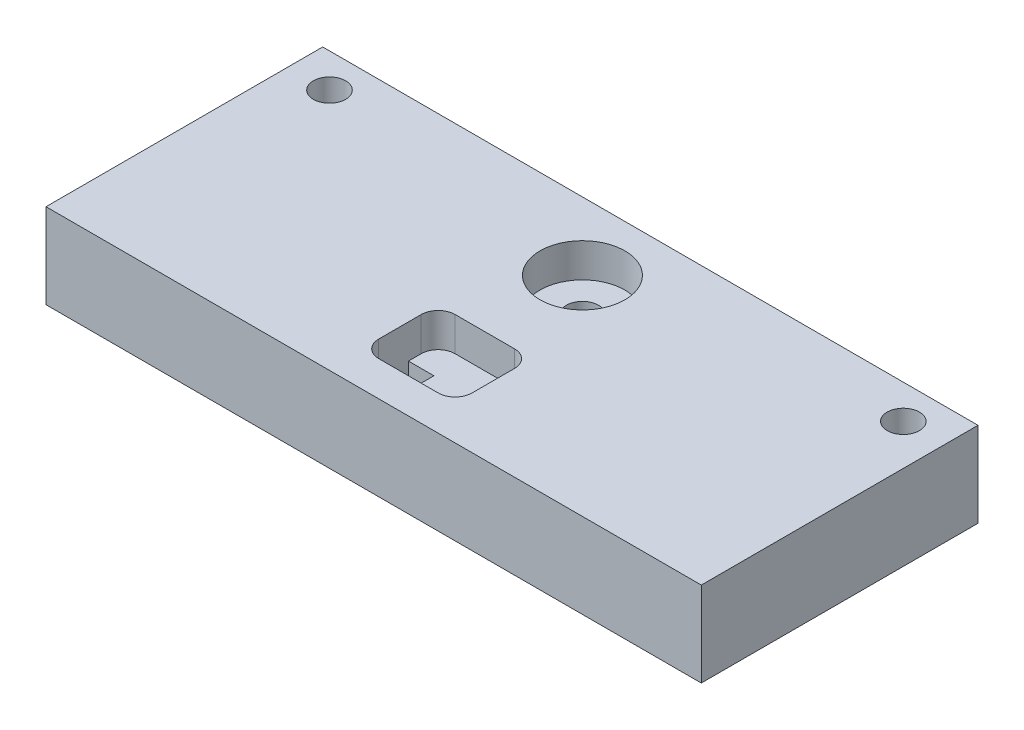
ISO-10303-21;
HEADER;
FILE_DESCRIPTION(('STEP AP214'),'2;1');
FILE_NAME('part.step','',(''),(''),'','','');
FILE_SCHEMA(('AUTOMOTIVE_DESIGN { 1 0 10303 214 1 1 1 1 }'));
ENDSEC;
DATA;
#1=APPLICATION_CONTEXT('core data for automotive mechanical design processes');
#2=APPLICATION_PROTOCOL_DEFINITION('international standard','automotive_design',2000,#1);
#3=PRODUCT_CONTEXT('',#1,'mechanical');
#4=PRODUCT('Part','Part','',(#3));
#5=PRODUCT_RELATED_PRODUCT_CATEGORY('part','',(#4));
#6=PRODUCT_DEFINITION_FORMATION('','',#4);
#7=PRODUCT_DEFINITION_CONTEXT('part definition',#1,'design');
#8=PRODUCT_DEFINITION('design','',#6,#7);
#9=PRODUCT_DEFINITION_SHAPE('','',#8);
#10=(LENGTH_UNIT() NAMED_UNIT(*) SI_UNIT(.MILLI.,.METRE.));
#11=(NAMED_UNIT(*) PLANE_ANGLE_UNIT() SI_UNIT($,.RADIAN.));
#12=(NAMED_UNIT(*) SI_UNIT($,.STERADIAN.) SOLID_ANGLE_UNIT());
#13=UNCERTAINTY_MEASURE_WITH_UNIT(LENGTH_MEASURE(1.E-05),#10,'distance_accuracy_value','');
#14=(GEOMETRIC_REPRESENTATION_CONTEXT(3) GLOBAL_UNCERTAINTY_ASSIGNED_CONTEXT((#13)) GLOBAL_UNIT_ASSIGNED_CONTEXT((#10,
#11,#12)) REPRESENTATION_CONTEXT('',''));
#15=CARTESIAN_POINT('',(0.,0.,0.));
#16=DIRECTION('',(0.,0.,1.));
#17=DIRECTION('',(1.,0.,0.));
#18=AXIS2_PLACEMENT_3D('',#15,#16,#17);
#19=CARTESIAN_POINT('',(0.,2.,0.));
#20=DIRECTION('',(0.,1.,0.));
#21=DIRECTION('',(0.,0.,1.));
#22=AXIS2_PLACEMENT_3D('',#19,#20,#21);
#23=PLANE('',#22);
#24=CARTESIAN_POINT('',(-16.8999999999963,2.,-9.99999999999545));
#25=DIRECTION('',(0.,1.,0.));
#26=DIRECTION('',(0.,0.,1.));
#27=AXIS2_PLACEMENT_3D('',#24,#25,#26);
#28=CIRCLE('',#27,0.950000000000001);
#29=CARTESIAN_POINT('',(-16.8999999999963,2.,-9.04999999999545));
#30=VERTEX_POINT('',#29);
#31=EDGE_CURVE('E298',#30,#30,#28,.T.);
#32=ORIENTED_EDGE('',*,*,#31,.F.);
#33=EDGE_LOOP('',(#32));
#34=FACE_BOUND('',#33,.T.);
#35=CARTESIAN_POINT('',(16.8999999999963,2.,-9.99999999999545));
#36=DIRECTION('',(0.,1.,0.));
#37=DIRECTION('',(0.,0.,1.));
#38=AXIS2_PLACEMENT_3D('',#35,#36,#37);
#39=CIRCLE('',#38,0.950000000000001);
#40=CARTESIAN_POINT('',(16.8999999999963,2.,-9.04999999999545));
#41=VERTEX_POINT('',#40);
#42=EDGE_CURVE('E301',#41,#41,#39,.T.);
#43=ORIENTED_EDGE('',*,*,#42,.F.);
#44=EDGE_LOOP('',(#43));
#45=FACE_BOUND('',#44,.T.);
#46=DIRECTION('',(0.,0.,1.));
#47=VECTOR('',#46,1.);
#48=CARTESIAN_POINT('',(-2.75,2.,-1.25));
#49=LINE('',#48,#47);
#50=CARTESIAN_POINT('',(-2.75,2.,-1.25));
#51=VERTEX_POINT('',#50);
#52=CARTESIAN_POINT('',(-2.75,2.,1.25));
#53=VERTEX_POINT('',#52);
#54=EDGE_CURVE('E404',#51,#53,#49,.T.);
#55=ORIENTED_EDGE('',*,*,#54,.F.);
#56=CARTESIAN_POINT('',(-1.75,2.,-1.25));
#57=DIRECTION('',(0.,1.,0.));
#58=DIRECTION('',(0.,0.,1.));
#59=AXIS2_PLACEMENT_3D('',#56,#57,#58);
#60=CIRCLE('',#59,1.);
#61=CARTESIAN_POINT('',(-1.75,2.,-2.25));
#62=VERTEX_POINT('',#61);
#63=EDGE_CURVE('E402',#62,#51,#60,.T.);
#64=ORIENTED_EDGE('',*,*,#63,.F.);
#65=DIRECTION('',(-1.,0.,0.));
#66=VECTOR('',#65,1.);
#67=CARTESIAN_POINT('',(-1.75,2.,-2.25));
#68=LINE('',#67,#66);
#69=CARTESIAN_POINT('',(1.75,2.,-2.25));
#70=VERTEX_POINT('',#69);
#71=EDGE_CURVE('E418',#70,#62,#68,.T.);
#72=ORIENTED_EDGE('',*,*,#71,.F.);
#73=CARTESIAN_POINT('',(1.75,2.,-1.25));
#74=DIRECTION('',(0.,1.,0.));
#75=DIRECTION('',(0.,0.,-1.));
#76=AXIS2_PLACEMENT_3D('',#73,#74,#75);
#77=CIRCLE('',#76,1.);
#78=CARTESIAN_POINT('',(2.75,2.,-1.25));
#79=VERTEX_POINT('',#78);
#80=EDGE_CURVE('E415',#79,#70,#77,.T.);
#81=ORIENTED_EDGE('',*,*,#80,.F.);
#82=DIRECTION('',(0.,0.,-1.));
#83=VECTOR('',#82,1.);
#84=CARTESIAN_POINT('',(2.75,2.,-1.25));
#85=LINE('',#84,#83);
#86=CARTESIAN_POINT('',(2.75,2.,1.25));
#87=VERTEX_POINT('',#86);
#88=EDGE_CURVE('E413',#87,#79,#85,.T.);
#89=ORIENTED_EDGE('',*,*,#88,.F.);
#90=CARTESIAN_POINT('',(1.75,2.,1.25));
#91=DIRECTION('',(0.,1.,0.));
#92=DIRECTION('',(0.,0.,-1.));
#93=AXIS2_PLACEMENT_3D('',#90,#91,#92);
#94=CIRCLE('',#93,1.);
#95=CARTESIAN_POINT('',(1.75,2.,2.25));
#96=VERTEX_POINT('',#95);
#97=EDGE_CURVE('E411',#96,#87,#94,.T.);
#98=ORIENTED_EDGE('',*,*,#97,.F.);
#99=DIRECTION('',(1.,0.,0.));
#100=VECTOR('',#99,1.);
#101=CARTESIAN_POINT('',(-1.75,2.,2.25));
#102=LINE('',#101,#100);
#103=CARTESIAN_POINT('',(-1.75,2.,2.25));
#104=VERTEX_POINT('',#103);
#105=EDGE_CURVE('E409',#104,#96,#102,.T.);
#106=ORIENTED_EDGE('',*,*,#105,.F.);
#107=CARTESIAN_POINT('',(-1.75,2.,1.25));
#108=DIRECTION('',(0.,1.,0.));
#109=DIRECTION('',(0.,0.,1.));
#110=AXIS2_PLACEMENT_3D('',#107,#108,#109);
#111=CIRCLE('',#110,1.);
#112=EDGE_CURVE('E407',#53,#104,#111,.T.);
#113=ORIENTED_EDGE('',*,*,#112,.F.);
#114=EDGE_LOOP('',(#55,#64,#72,#81,#89,#98,#106,#113));
#115=FACE_BOUND('',#114,.T.);
#116=DIRECTION('',(-1.,0.,0.));
#117=VECTOR('',#116,1.);
#118=CARTESIAN_POINT('',(-5.00000000000001,2.,-12.));
#119=LINE('',#118,#117);
#120=CARTESIAN_POINT('',(19.3,2.,-12.));
#121=VERTEX_POINT('',#120);
#122=CARTESIAN_POINT('',(-19.3,2.,-12.));
#123=VERTEX_POINT('',#122);
#124=EDGE_CURVE('E11',#121,#123,#119,.T.);
#125=ORIENTED_EDGE('',*,*,#124,.T.);
#126=DIRECTION('',(0.,0.,-1.));
#127=VECTOR('',#126,1.);
#128=CARTESIAN_POINT('',(-19.3,2.,-12.));
#129=LINE('',#128,#127);
#130=CARTESIAN_POINT('',(-19.3,2.,4.29999999999999));
#131=VERTEX_POINT('',#130);
#132=EDGE_CURVE('E309',#131,#123,#129,.T.);
#133=ORIENTED_EDGE('',*,*,#132,.F.);
#134=DIRECTION('',(1.,0.,0.));
#135=VECTOR('',#134,1.);
#136=CARTESIAN_POINT('',(-5.,2.,4.3));
#137=LINE('',#136,#135);
#138=CARTESIAN_POINT('',(19.3,2.,4.3));
#139=VERTEX_POINT('',#138);
#140=EDGE_CURVE('E49',#131,#139,#137,.T.);
#141=ORIENTED_EDGE('',*,*,#140,.T.);
#142=DIRECTION('',(0.,0.,1.));
#143=VECTOR('',#142,1.);
#144=CARTESIAN_POINT('',(19.3,2.,-12.));
#145=LINE('',#144,#143);
#146=EDGE_CURVE('E318',#121,#139,#145,.T.);
#147=ORIENTED_EDGE('',*,*,#146,.F.);
#148=EDGE_LOOP('',(#125,#133,#141,#147));
#149=FACE_BOUND('',#148,.T.);
#150=CARTESIAN_POINT('',(0.,2.,-8.));
#151=DIRECTION('',(0.,1.,0.));
#152=DIRECTION('',(0.,0.,1.));
#153=AXIS2_PLACEMENT_3D('',#150,#151,#152);
#154=CIRCLE('',#153,2.5);
#155=CARTESIAN_POINT('',(0.,2.,-5.5));
#156=VERTEX_POINT('',#155);
#157=EDGE_CURVE('E396',#156,#156,#154,.T.);
#158=ORIENTED_EDGE('',*,*,#157,.F.);
#159=EDGE_LOOP('',(#158));
#160=FACE_BOUND('',#159,.T.);
#161=ADVANCED_FACE('F41',(#34,#45,#115,#149,#160),#23,.T.);
#162=CARTESIAN_POINT('',(-5.,2.,4.3));
#163=DIRECTION('',(0.,0.,-1.));
#164=DIRECTION('',(-1.,0.,0.));
#165=AXIS2_PLACEMENT_3D('',#162,#163,#164);
#166=PLANE('',#165);
#167=ORIENTED_EDGE('',*,*,#140,.F.);
#168=DIRECTION('',(0.,-1.,0.));
#169=VECTOR('',#168,1.);
#170=CARTESIAN_POINT('',(-19.3,2.,4.29999999999999));
#171=LINE('',#170,#169);
#172=CARTESIAN_POINT('',(-19.3,-3.,4.29999999999999));
#173=VERTEX_POINT('',#172);
#174=EDGE_CURVE('E306',#131,#173,#171,.T.);
#175=ORIENTED_EDGE('',*,*,#174,.T.);
#176=DIRECTION('',(-1.,0.,0.));
#177=VECTOR('',#176,1.);
#178=CARTESIAN_POINT('',(-5.,-3.,4.3));
#179=LINE('',#178,#177);
#180=CARTESIAN_POINT('',(19.3,-3.,4.3));
#181=VERTEX_POINT('',#180);
#182=EDGE_CURVE('E393',#181,#173,#179,.T.);
#183=ORIENTED_EDGE('',*,*,#182,.F.);
#184=DIRECTION('',(0.,-1.,0.));
#185=VECTOR('',#184,1.);
#186=CARTESIAN_POINT('',(19.3,2.,4.3));
#187=LINE('',#186,#185);
#188=EDGE_CURVE('E324',#139,#181,#187,.T.);
#189=ORIENTED_EDGE('',*,*,#188,.F.);
#190=EDGE_LOOP('',(#167,#175,#183,#189));
#191=FACE_BOUND('',#190,.T.);
#192=ADVANCED_FACE('F43',(#191),#166,.F.);
#193=CARTESIAN_POINT('',(-5.00000000000001,2.,-12.));
#194=DIRECTION('',(0.,0.,1.));
#195=DIRECTION('',(1.,0.,0.));
#196=AXIS2_PLACEMENT_3D('',#193,#194,#195);
#197=PLANE('',#196);
#198=ORIENTED_EDGE('',*,*,#124,.F.);
#199=DIRECTION('',(0.,-1.,0.));
#200=VECTOR('',#199,1.);
#201=CARTESIAN_POINT('',(19.3,2.,-12.));
#202=LINE('',#201,#200);
#203=CARTESIAN_POINT('',(19.3,-3.,-12.));
#204=VERTEX_POINT('',#203);
#205=EDGE_CURVE('E321',#121,#204,#202,.T.);
#206=ORIENTED_EDGE('',*,*,#205,.T.);
#207=DIRECTION('',(1.,0.,0.));
#208=VECTOR('',#207,1.);
#209=CARTESIAN_POINT('',(-5.,-3.,-12.));
#210=LINE('',#209,#208);
#211=CARTESIAN_POINT('',(-19.3,-3.,-12.));
#212=VERTEX_POINT('',#211);
#213=EDGE_CURVE('E389',#212,#204,#210,.T.);
#214=ORIENTED_EDGE('',*,*,#213,.F.);
#215=DIRECTION('',(0.,-1.,0.));
#216=VECTOR('',#215,1.);
#217=CARTESIAN_POINT('',(-19.3,2.,-12.));
#218=LINE('',#217,#216);
#219=EDGE_CURVE('E297',#123,#212,#218,.T.);
#220=ORIENTED_EDGE('',*,*,#219,.F.);
#221=EDGE_LOOP('',(#198,#206,#214,#220));
#222=FACE_BOUND('',#221,.T.);
#223=ADVANCED_FACE('F470',(#222),#197,.F.);
#224=CARTESIAN_POINT('',(-1.75,2.,-1.25));
#225=DIRECTION('',(0.,-1.,0.));
#226=DIRECTION('',(0.,0.,-1.));
#227=AXIS2_PLACEMENT_3D('',#224,#225,#226);
#228=CYLINDRICAL_SURFACE('',#227,1.);
#229=CARTESIAN_POINT('',(-1.75,0.,-1.25));
#230=DIRECTION('',(0.,1.,0.));
#231=DIRECTION('',(0.,0.,1.));
#232=AXIS2_PLACEMENT_3D('',#229,#230,#231);
#233=CIRCLE('',#232,1.);
#234=CARTESIAN_POINT('',(-1.75,0.,-2.25));
#235=VERTEX_POINT('',#234);
#236=CARTESIAN_POINT('',(-2.75,0.,-1.25));
#237=VERTEX_POINT('',#236);
#238=EDGE_CURVE('E399',#235,#237,#233,.T.);
#239=ORIENTED_EDGE('',*,*,#238,.F.);
#240=DIRECTION('',(0.,-1.,0.));
#241=VECTOR('',#240,1.);
#242=CARTESIAN_POINT('',(-1.75,2.,-2.25));
#243=LINE('',#242,#241);
#244=EDGE_CURVE('E420',#62,#235,#243,.T.);
#245=ORIENTED_EDGE('',*,*,#244,.F.);
#246=ORIENTED_EDGE('',*,*,#63,.T.);
#247=DIRECTION('',(0.,-1.,0.));
#248=VECTOR('',#247,1.);
#249=CARTESIAN_POINT('',(-2.75,2.,-1.25));
#250=LINE('',#249,#248);
#251=EDGE_CURVE('E456',#51,#237,#250,.T.);
#252=ORIENTED_EDGE('',*,*,#251,.T.);
#253=EDGE_LOOP('',(#239,#245,#246,#252));
#254=FACE_BOUND('',#253,.T.);
#255=ADVANCED_FACE('F525',(#254),#228,.F.);
#256=CARTESIAN_POINT('',(-2.75,2.,-1.25));
#257=DIRECTION('',(1.,0.,0.));
#258=DIRECTION('',(0.,0.,-1.));
#259=AXIS2_PLACEMENT_3D('',#256,#257,#258);
#260=PLANE('',#259);
#261=DIRECTION('',(0.,0.,1.));
#262=VECTOR('',#261,1.);
#263=CARTESIAN_POINT('',(-2.75,0.,-1.25));
#264=LINE('',#263,#262);
#265=CARTESIAN_POINT('',(-2.75,0.,-0.5));
#266=VERTEX_POINT('',#265);
#267=EDGE_CURVE('E424',#237,#266,#264,.T.);
#268=ORIENTED_EDGE('',*,*,#267,.F.);
#269=ORIENTED_EDGE('',*,*,#251,.F.);
#270=ORIENTED_EDGE('',*,*,#54,.T.);
#271=DIRECTION('',(0.,-1.,0.));
#272=VECTOR('',#271,1.);
#273=CARTESIAN_POINT('',(-2.75,2.,1.25));
#274=LINE('',#273,#272);
#275=CARTESIAN_POINT('',(-2.75,0.,1.25));
#276=VERTEX_POINT('',#275);
#277=EDGE_CURVE('E454',#53,#276,#274,.T.);
#278=ORIENTED_EDGE('',*,*,#277,.T.);
#279=CARTESIAN_POINT('',(-2.75,0.,0.5));
#280=VERTEX_POINT('',#279);
#281=EDGE_CURVE('E423',#280,#276,#264,.T.);
#282=ORIENTED_EDGE('',*,*,#281,.F.);
#283=DIRECTION('',(0.,1.,0.));
#284=VECTOR('',#283,1.);
#285=CARTESIAN_POINT('',(-2.75,-3.,0.499999999999999));
#286=LINE('',#285,#284);
#287=CARTESIAN_POINT('',(-2.75,-3.,0.499999999999999));
#288=VERTEX_POINT('',#287);
#289=EDGE_CURVE('E368',#288,#280,#286,.T.);
#290=ORIENTED_EDGE('',*,*,#289,.F.);
#291=DIRECTION('',(0.,0.,-1.));
#292=VECTOR('',#291,1.);
#293=CARTESIAN_POINT('',(-2.75,-3.,-0.500000000000001));
#294=LINE('',#293,#292);
#295=CARTESIAN_POINT('',(-2.75,-3.,-0.500000000000001));
#296=VERTEX_POINT('',#295);
#297=EDGE_CURVE('E358',#288,#296,#294,.T.);
#298=ORIENTED_EDGE('',*,*,#297,.T.);
#299=DIRECTION('',(0.,1.,0.));
#300=VECTOR('',#299,1.);
#301=CARTESIAN_POINT('',(-2.75,-3.,-0.500000000000001));
#302=LINE('',#301,#300);
#303=EDGE_CURVE('E382',#296,#266,#302,.T.);
#304=ORIENTED_EDGE('',*,*,#303,.T.);
#305=EDGE_LOOP('',(#268,#269,#270,#278,#282,#290,#298,#304));
#306=FACE_BOUND('',#305,.T.);
#307=ADVANCED_FACE('F534',(#306),#260,.T.);
#308=CARTESIAN_POINT('',(-1.75,2.,1.25));
#309=DIRECTION('',(0.,-1.,0.));
#310=DIRECTION('',(0.,0.,-1.));
#311=AXIS2_PLACEMENT_3D('',#308,#309,#310);
#312=CYLINDRICAL_SURFACE('',#311,1.);
#313=CARTESIAN_POINT('',(-1.75,0.,1.25));
#314=DIRECTION('',(0.,1.,0.));
#315=DIRECTION('',(0.,0.,1.));
#316=AXIS2_PLACEMENT_3D('',#313,#314,#315);
#317=CIRCLE('',#316,1.);
#318=CARTESIAN_POINT('',(-1.75,0.,2.25));
#319=VERTEX_POINT('',#318);
#320=EDGE_CURVE('E426',#276,#319,#317,.T.);
#321=ORIENTED_EDGE('',*,*,#320,.F.);
#322=ORIENTED_EDGE('',*,*,#277,.F.);
#323=ORIENTED_EDGE('',*,*,#112,.T.);
#324=DIRECTION('',(0.,-1.,0.));
#325=VECTOR('',#324,1.);
#326=CARTESIAN_POINT('',(-1.75,2.,2.25));
#327=LINE('',#326,#325);
#328=EDGE_CURVE('E452',#104,#319,#327,.T.);
#329=ORIENTED_EDGE('',*,*,#328,.T.);
#330=EDGE_LOOP('',(#321,#322,#323,#329));
#331=FACE_BOUND('',#330,.T.);
#332=ADVANCED_FACE('F548',(#331),#312,.F.);
#333=CARTESIAN_POINT('',(-1.75,2.,2.25));
#334=DIRECTION('',(0.,0.,-1.));
#335=DIRECTION('',(-1.,0.,0.));
#336=AXIS2_PLACEMENT_3D('',#333,#334,#335);
#337=PLANE('',#336);
#338=DIRECTION('',(1.,0.,0.));
#339=VECTOR('',#338,1.);
#340=CARTESIAN_POINT('',(-1.75,0.,2.25));
#341=LINE('',#340,#339);
#342=CARTESIAN_POINT('',(1.75,0.,2.25));
#343=VERTEX_POINT('',#342);
#344=EDGE_CURVE('E429',#319,#343,#341,.T.);
#345=ORIENTED_EDGE('',*,*,#344,.F.);
#346=ORIENTED_EDGE('',*,*,#328,.F.);
#347=ORIENTED_EDGE('',*,*,#105,.T.);
#348=DIRECTION('',(0.,-1.,0.));
#349=VECTOR('',#348,1.);
#350=CARTESIAN_POINT('',(1.75,2.,2.25));
#351=LINE('',#350,#349);
#352=EDGE_CURVE('E450',#96,#343,#351,.T.);
#353=ORIENTED_EDGE('',*,*,#352,.T.);
#354=EDGE_LOOP('',(#345,#346,#347,#353));
#355=FACE_BOUND('',#354,.T.);
#356=ADVANCED_FACE('F553',(#355),#337,.T.);
#357=CARTESIAN_POINT('',(1.75,2.,1.25));
#358=DIRECTION('',(0.,-1.,0.));
#359=DIRECTION('',(0.,0.,-1.));
#360=AXIS2_PLACEMENT_3D('',#357,#358,#359);
#361=CYLINDRICAL_SURFACE('',#360,1.);
#362=CARTESIAN_POINT('',(1.75,0.,1.25));
#363=DIRECTION('',(0.,1.,0.));
#364=DIRECTION('',(0.,0.,-1.));
#365=AXIS2_PLACEMENT_3D('',#362,#363,#364);
#366=CIRCLE('',#365,1.);
#367=CARTESIAN_POINT('',(2.75,0.,1.25));
#368=VERTEX_POINT('',#367);
#369=EDGE_CURVE('E432',#343,#368,#366,.T.);
#370=ORIENTED_EDGE('',*,*,#369,.F.);
#371=ORIENTED_EDGE('',*,*,#352,.F.);
#372=ORIENTED_EDGE('',*,*,#97,.T.);
#373=DIRECTION('',(0.,-1.,0.));
#374=VECTOR('',#373,1.);
#375=CARTESIAN_POINT('',(2.75,2.,1.25));
#376=LINE('',#375,#374);
#377=EDGE_CURVE('E448',#87,#368,#376,.T.);
#378=ORIENTED_EDGE('',*,*,#377,.T.);
#379=EDGE_LOOP('',(#370,#371,#372,#378));
#380=FACE_BOUND('',#379,.T.);
#381=ADVANCED_FACE('F557',(#380),#361,.F.);
#382=CARTESIAN_POINT('',(2.75,2.,-1.25));
#383=DIRECTION('',(-1.,0.,0.));
#384=DIRECTION('',(0.,0.,1.));
#385=AXIS2_PLACEMENT_3D('',#382,#383,#384);
#386=PLANE('',#385);
#387=DIRECTION('',(0.,0.,-1.));
#388=VECTOR('',#387,1.);
#389=CARTESIAN_POINT('',(2.75,0.,-1.25));
#390=LINE('',#389,#388);
#391=CARTESIAN_POINT('',(2.75,0.,0.5));
#392=VERTEX_POINT('',#391);
#393=EDGE_CURVE('E436',#368,#392,#390,.T.);
#394=ORIENTED_EDGE('',*,*,#393,.F.);
#395=ORIENTED_EDGE('',*,*,#377,.F.);
#396=ORIENTED_EDGE('',*,*,#88,.T.);
#397=DIRECTION('',(0.,-1.,0.));
#398=VECTOR('',#397,1.);
#399=CARTESIAN_POINT('',(2.75,2.,-1.25));
#400=LINE('',#399,#398);
#401=CARTESIAN_POINT('',(2.75,0.,-1.25));
#402=VERTEX_POINT('',#401);
#403=EDGE_CURVE('E446',#79,#402,#400,.T.);
#404=ORIENTED_EDGE('',*,*,#403,.T.);
#405=CARTESIAN_POINT('',(2.75,0.,-0.5));
#406=VERTEX_POINT('',#405);
#407=EDGE_CURVE('E435',#406,#402,#390,.T.);
#408=ORIENTED_EDGE('',*,*,#407,.F.);
#409=DIRECTION('',(0.,1.,0.));
#410=VECTOR('',#409,1.);
#411=CARTESIAN_POINT('',(2.75,-3.,-0.5));
#412=LINE('',#411,#410);
#413=CARTESIAN_POINT('',(2.75,-3.,-0.5));
#414=VERTEX_POINT('',#413);
#415=EDGE_CURVE('E340',#414,#406,#412,.T.);
#416=ORIENTED_EDGE('',*,*,#415,.F.);
#417=DIRECTION('',(0.,0.,1.));
#418=VECTOR('',#417,1.);
#419=CARTESIAN_POINT('',(2.75,-3.,-0.5));
#420=LINE('',#419,#418);
#421=CARTESIAN_POINT('',(2.75,-3.,0.5));
#422=VERTEX_POINT('',#421);
#423=EDGE_CURVE('E330',#414,#422,#420,.T.);
#424=ORIENTED_EDGE('',*,*,#423,.T.);
#425=DIRECTION('',(0.,1.,0.));
#426=VECTOR('',#425,1.);
#427=CARTESIAN_POINT('',(2.75,-3.,0.5));
#428=LINE('',#427,#426);
#429=EDGE_CURVE('E354',#422,#392,#428,.T.);
#430=ORIENTED_EDGE('',*,*,#429,.T.);
#431=EDGE_LOOP('',(#394,#395,#396,#404,#408,#416,#424,#430));
#432=FACE_BOUND('',#431,.T.);
#433=ADVANCED_FACE('F506',(#432),#386,.T.);
#434=CARTESIAN_POINT('',(1.75,2.,-1.25));
#435=DIRECTION('',(0.,-1.,0.));
#436=DIRECTION('',(0.,0.,-1.));
#437=AXIS2_PLACEMENT_3D('',#434,#435,#436);
#438=CYLINDRICAL_SURFACE('',#437,1.);
#439=CARTESIAN_POINT('',(1.75,0.,-1.25));
#440=DIRECTION('',(0.,1.,0.));
#441=DIRECTION('',(0.,0.,-1.));
#442=AXIS2_PLACEMENT_3D('',#439,#440,#441);
#443=CIRCLE('',#442,1.);
#444=CARTESIAN_POINT('',(1.75,0.,-2.25));
#445=VERTEX_POINT('',#444);
#446=EDGE_CURVE('E438',#402,#445,#443,.T.);
#447=ORIENTED_EDGE('',*,*,#446,.F.);
#448=ORIENTED_EDGE('',*,*,#403,.F.);
#449=ORIENTED_EDGE('',*,*,#80,.T.);
#450=DIRECTION('',(0.,-1.,0.));
#451=VECTOR('',#450,1.);
#452=CARTESIAN_POINT('',(1.75,2.,-2.25));
#453=LINE('',#452,#451);
#454=EDGE_CURVE('E444',#70,#445,#453,.T.);
#455=ORIENTED_EDGE('',*,*,#454,.T.);
#456=EDGE_LOOP('',(#447,#448,#449,#455));
#457=FACE_BOUND('',#456,.T.);
#458=ADVANCED_FACE('F516',(#457),#438,.F.);
#459=CARTESIAN_POINT('',(-1.75,2.,-2.25));
#460=DIRECTION('',(0.,0.,1.));
#461=DIRECTION('',(1.,0.,0.));
#462=AXIS2_PLACEMENT_3D('',#459,#460,#461);
#463=PLANE('',#462);
#464=DIRECTION('',(-1.,0.,0.));
#465=VECTOR('',#464,1.);
#466=CARTESIAN_POINT('',(-1.75,0.,-2.25));
#467=LINE('',#466,#465);
#468=EDGE_CURVE('E405',#445,#235,#467,.T.);
#469=ORIENTED_EDGE('',*,*,#468,.F.);
#470=ORIENTED_EDGE('',*,*,#454,.F.);
#471=ORIENTED_EDGE('',*,*,#71,.T.);
#472=ORIENTED_EDGE('',*,*,#244,.T.);
#473=EDGE_LOOP('',(#469,#470,#471,#472));
#474=FACE_BOUND('',#473,.T.);
#475=ADVANCED_FACE('F520',(#474),#463,.T.);
#476=CARTESIAN_POINT('',(0.,2.,-8.));
#477=DIRECTION('',(0.,-1.,0.));
#478=DIRECTION('',(0.,0.,-1.));
#479=AXIS2_PLACEMENT_3D('',#476,#477,#478);
#480=CYLINDRICAL_SURFACE('',#479,2.5);
#481=ORIENTED_EDGE('',*,*,#157,.T.);
#482=EDGE_LOOP('',(#481));
#483=FACE_BOUND('',#482,.T.);
#484=CARTESIAN_POINT('',(0.,0.,-8.));
#485=DIRECTION('',(0.,1.,0.));
#486=DIRECTION('',(0.,0.,1.));
#487=AXIS2_PLACEMENT_3D('',#484,#485,#486);
#488=CIRCLE('',#487,2.5);
#489=CARTESIAN_POINT('',(0.,0.,-5.5));
#490=VERTEX_POINT('',#489);
#491=EDGE_CURVE('E395',#490,#490,#488,.T.);
#492=ORIENTED_EDGE('',*,*,#491,.F.);
#493=EDGE_LOOP('',(#492));
#494=FACE_BOUND('',#493,.T.);
#495=ADVANCED_FACE('F597',(#483,#494),#480,.F.);
#496=CARTESIAN_POINT('',(0.,0.,0.));
#497=DIRECTION('',(0.,-1.,0.));
#498=DIRECTION('',(0.,0.,-1.));
#499=AXIS2_PLACEMENT_3D('',#496,#497,#498);
#500=PLANE('',#499);
#501=DIRECTION('',(-1.,0.,0.));
#502=VECTOR('',#501,1.);
#503=CARTESIAN_POINT('',(-1.25,0.,0.5));
#504=LINE('',#503,#502);
#505=CARTESIAN_POINT('',(-1.25,0.,0.5));
#506=VERTEX_POINT('',#505);
#507=EDGE_CURVE('E361',#506,#280,#504,.T.);
#508=ORIENTED_EDGE('',*,*,#507,.T.);
#509=ORIENTED_EDGE('',*,*,#281,.T.);
#510=ORIENTED_EDGE('',*,*,#320,.T.);
#511=ORIENTED_EDGE('',*,*,#344,.T.);
#512=ORIENTED_EDGE('',*,*,#369,.T.);
#513=ORIENTED_EDGE('',*,*,#393,.T.);
#514=DIRECTION('',(-1.,0.,0.));
#515=VECTOR('',#514,1.);
#516=CARTESIAN_POINT('',(1.25,0.,0.5));
#517=LINE('',#516,#515);
#518=CARTESIAN_POINT('',(1.25,0.,0.5));
#519=VERTEX_POINT('',#518);
#520=EDGE_CURVE('E327',#392,#519,#517,.T.);
#521=ORIENTED_EDGE('',*,*,#520,.T.);
#522=DIRECTION('',(0.,0.,-1.));
#523=VECTOR('',#522,1.);
#524=CARTESIAN_POINT('',(1.25,0.,-0.5));
#525=LINE('',#524,#523);
#526=CARTESIAN_POINT('',(1.25,0.,-0.5));
#527=VERTEX_POINT('',#526);
#528=EDGE_CURVE('E343',#519,#527,#525,.T.);
#529=ORIENTED_EDGE('',*,*,#528,.T.);
#530=DIRECTION('',(1.,0.,0.));
#531=VECTOR('',#530,1.);
#532=CARTESIAN_POINT('',(1.25,0.,-0.5));
#533=LINE('',#532,#531);
#534=EDGE_CURVE('E333',#527,#406,#533,.T.);
#535=ORIENTED_EDGE('',*,*,#534,.T.);
#536=ORIENTED_EDGE('',*,*,#407,.T.);
#537=ORIENTED_EDGE('',*,*,#446,.T.);
#538=ORIENTED_EDGE('',*,*,#468,.T.);
#539=ORIENTED_EDGE('',*,*,#238,.T.);
#540=ORIENTED_EDGE('',*,*,#267,.T.);
#541=DIRECTION('',(1.,0.,0.));
#542=VECTOR('',#541,1.);
#543=CARTESIAN_POINT('',(-1.25,0.,-0.5));
#544=LINE('',#543,#542);
#545=CARTESIAN_POINT('',(-1.25,0.,-0.5));
#546=VERTEX_POINT('',#545);
#547=EDGE_CURVE('E357',#266,#546,#544,.T.);
#548=ORIENTED_EDGE('',*,*,#547,.T.);
#549=DIRECTION('',(0.,0.,1.));
#550=VECTOR('',#549,1.);
#551=CARTESIAN_POINT('',(-1.25,0.,-0.5));
#552=LINE('',#551,#550);
#553=EDGE_CURVE('E371',#546,#506,#552,.T.);
#554=ORIENTED_EDGE('',*,*,#553,.T.);
#555=EDGE_LOOP('',(#508,#509,#510,#511,#512,#513,#521,#529,#535,#536,#537,#538,#539,#540,#548,#554));
#556=FACE_BOUND('',#555,.T.);
#557=ADVANCED_FACE('F503',(#556),#500,.F.);
#558=CARTESIAN_POINT('',(0.,0.,-8.));
#559=DIRECTION('',(0.,-1.,0.));
#560=DIRECTION('',(0.,0.,-1.));
#561=AXIS2_PLACEMENT_3D('',#558,#559,#560);
#562=CIRCLE('',#561,0.95);
#563=CARTESIAN_POINT('',(0.,0.,-8.95));
#564=VERTEX_POINT('',#563);
#565=EDGE_CURVE('E385',#564,#564,#562,.T.);
#566=ORIENTED_EDGE('',*,*,#565,.T.);
#567=EDGE_LOOP('',(#566));
#568=FACE_BOUND('',#567,.T.);
#569=ORIENTED_EDGE('',*,*,#491,.T.);
#570=EDGE_LOOP('',(#569));
#571=FACE_BOUND('',#570,.T.);
#572=ADVANCED_FACE('F480',(#568,#571),#500,.F.);
#573=CARTESIAN_POINT('',(0.,-3.,0.));
#574=DIRECTION('',(0.,-1.,0.));
#575=DIRECTION('',(0.,0.,-1.));
#576=AXIS2_PLACEMENT_3D('',#573,#574,#575);
#577=PLANE('',#576);
#578=DIRECTION('',(0.,0.,1.));
#579=VECTOR('',#578,1.);
#580=CARTESIAN_POINT('',(-6.,-3.,2.3));
#581=LINE('',#580,#579);
#582=CARTESIAN_POINT('',(-6.,-3.,-7.7));
#583=VERTEX_POINT('',#582);
#584=CARTESIAN_POINT('',(-6.,-3.,2.3));
#585=VERTEX_POINT('',#584);
#586=EDGE_CURVE('E56',#583,#585,#581,.T.);
#587=ORIENTED_EDGE('',*,*,#586,.F.);
#588=DIRECTION('',(1.,0.,0.));
#589=VECTOR('',#588,1.);
#590=CARTESIAN_POINT('',(-11.,-3.,-7.7));
#591=LINE('',#590,#589);
#592=CARTESIAN_POINT('',(-11.,-3.,-7.7));
#593=VERTEX_POINT('',#592);
#594=EDGE_CURVE('E245',#593,#583,#591,.T.);
#595=ORIENTED_EDGE('',*,*,#594,.F.);
#596=DIRECTION('',(0.,0.,-1.));
#597=VECTOR('',#596,1.);
#598=CARTESIAN_POINT('',(-11.,-3.,2.3));
#599=LINE('',#598,#597);
#600=CARTESIAN_POINT('',(-11.,-3.,2.3));
#601=VERTEX_POINT('',#600);
#602=EDGE_CURVE('E248',#601,#593,#599,.T.);
#603=ORIENTED_EDGE('',*,*,#602,.F.);
#604=DIRECTION('',(-1.,0.,0.));
#605=VECTOR('',#604,1.);
#606=CARTESIAN_POINT('',(-11.,-3.,2.3));
#607=LINE('',#606,#605);
#608=EDGE_CURVE('E254',#585,#601,#607,.T.);
#609=ORIENTED_EDGE('',*,*,#608,.F.);
#610=EDGE_LOOP('',(#587,#595,#603,#609));
#611=FACE_BOUND('',#610,.T.);
#612=DIRECTION('',(0.,0.,1.));
#613=VECTOR('',#612,1.);
#614=CARTESIAN_POINT('',(11.,-3.,2.3));
#615=LINE('',#614,#613);
#616=CARTESIAN_POINT('',(11.,-3.,-7.7));
#617=VERTEX_POINT('',#616);
#618=CARTESIAN_POINT('',(11.,-3.,2.3));
#619=VERTEX_POINT('',#618);
#620=EDGE_CURVE('E64',#617,#619,#615,.T.);
#621=ORIENTED_EDGE('',*,*,#620,.F.);
#622=DIRECTION('',(1.,0.,0.));
#623=VECTOR('',#622,1.);
#624=CARTESIAN_POINT('',(6.,-3.,-7.7));
#625=LINE('',#624,#623);
#626=CARTESIAN_POINT('',(6.,-3.,-7.7));
#627=VERTEX_POINT('',#626);
#628=EDGE_CURVE('E273',#627,#617,#625,.T.);
#629=ORIENTED_EDGE('',*,*,#628,.F.);
#630=DIRECTION('',(0.,0.,-1.));
#631=VECTOR('',#630,1.);
#632=CARTESIAN_POINT('',(6.,-3.,2.3));
#633=LINE('',#632,#631);
#634=CARTESIAN_POINT('',(6.,-3.,2.3));
#635=VERTEX_POINT('',#634);
#636=EDGE_CURVE('E276',#635,#627,#633,.T.);
#637=ORIENTED_EDGE('',*,*,#636,.F.);
#638=DIRECTION('',(-1.,0.,0.));
#639=VECTOR('',#638,1.);
#640=CARTESIAN_POINT('',(6.,-3.,2.3));
#641=LINE('',#640,#639);
#642=EDGE_CURVE('E280',#619,#635,#641,.T.);
#643=ORIENTED_EDGE('',*,*,#642,.F.);
#644=EDGE_LOOP('',(#621,#629,#637,#643));
#645=FACE_BOUND('',#644,.T.);
#646=CARTESIAN_POINT('',(-16.8999999999963,-3.,-9.99999999999545));
#647=DIRECTION('',(0.,1.,0.));
#648=DIRECTION('',(0.,0.,1.));
#649=AXIS2_PLACEMENT_3D('',#646,#647,#648);
#650=CIRCLE('',#649,0.950000000000001);
#651=CARTESIAN_POINT('',(-16.8999999999963,-3.,-9.04999999999545));
#652=VERTEX_POINT('',#651);
#653=EDGE_CURVE('E294',#652,#652,#650,.T.);
#654=ORIENTED_EDGE('',*,*,#653,.T.);
#655=EDGE_LOOP('',(#654));
#656=FACE_BOUND('',#655,.T.);
#657=CARTESIAN_POINT('',(16.8999999999963,-3.,-9.99999999999545));
#658=DIRECTION('',(0.,1.,0.));
#659=DIRECTION('',(0.,0.,1.));
#660=AXIS2_PLACEMENT_3D('',#657,#658,#659);
#661=CIRCLE('',#660,0.950000000000001);
#662=CARTESIAN_POINT('',(16.8999999999963,-3.,-9.04999999999545));
#663=VERTEX_POINT('',#662);
#664=EDGE_CURVE('E260',#663,#663,#661,.T.);
#665=ORIENTED_EDGE('',*,*,#664,.T.);
#666=EDGE_LOOP('',(#665));
#667=FACE_BOUND('',#666,.T.);
#668=ORIENTED_EDGE('',*,*,#182,.T.);
#669=DIRECTION('',(0.,0.,-1.));
#670=VECTOR('',#669,1.);
#671=CARTESIAN_POINT('',(-19.3,-3.,-12.));
#672=LINE('',#671,#670);
#673=EDGE_CURVE('E312',#173,#212,#672,.T.);
#674=ORIENTED_EDGE('',*,*,#673,.T.);
#675=ORIENTED_EDGE('',*,*,#213,.T.);
#676=DIRECTION('',(0.,0.,1.));
#677=VECTOR('',#676,1.);
#678=CARTESIAN_POINT('',(19.3,-3.,-12.));
#679=LINE('',#678,#677);
#680=EDGE_CURVE('E315',#204,#181,#679,.T.);
#681=ORIENTED_EDGE('',*,*,#680,.T.);
#682=EDGE_LOOP('',(#668,#674,#675,#681));
#683=FACE_BOUND('',#682,.T.);
#684=CARTESIAN_POINT('',(0.,-3.,-8.));
#685=DIRECTION('',(0.,-1.,0.));
#686=DIRECTION('',(0.,0.,-1.));
#687=AXIS2_PLACEMENT_3D('',#684,#685,#686);
#688=CIRCLE('',#687,0.95);
#689=CARTESIAN_POINT('',(0.,-3.,-8.95));
#690=VERTEX_POINT('',#689);
#691=EDGE_CURVE('E386',#690,#690,#688,.T.);
#692=ORIENTED_EDGE('',*,*,#691,.F.);
#693=EDGE_LOOP('',(#692));
#694=FACE_BOUND('',#693,.T.);
#695=DIRECTION('',(1.,0.,0.));
#696=VECTOR('',#695,1.);
#697=CARTESIAN_POINT('',(-1.25,-3.,-0.5));
#698=LINE('',#697,#696);
#699=CARTESIAN_POINT('',(-1.25,-3.,-0.5));
#700=VERTEX_POINT('',#699);
#701=EDGE_CURVE('E360',#296,#700,#698,.T.);
#702=ORIENTED_EDGE('',*,*,#701,.F.);
#703=ORIENTED_EDGE('',*,*,#297,.F.);
#704=DIRECTION('',(-1.,0.,0.));
#705=VECTOR('',#704,1.);
#706=CARTESIAN_POINT('',(-1.25,-3.,0.5));
#707=LINE('',#706,#705);
#708=CARTESIAN_POINT('',(-1.25,-3.,0.5));
#709=VERTEX_POINT('',#708);
#710=EDGE_CURVE('E366',#709,#288,#707,.T.);
#711=ORIENTED_EDGE('',*,*,#710,.F.);
#712=DIRECTION('',(0.,0.,1.));
#713=VECTOR('',#712,1.);
#714=CARTESIAN_POINT('',(-1.25,-3.,-0.5));
#715=LINE('',#714,#713);
#716=EDGE_CURVE('E363',#700,#709,#715,.T.);
#717=ORIENTED_EDGE('',*,*,#716,.F.);
#718=EDGE_LOOP('',(#702,#703,#711,#717));
#719=FACE_BOUND('',#718,.T.);
#720=DIRECTION('',(-1.,0.,0.));
#721=VECTOR('',#720,1.);
#722=CARTESIAN_POINT('',(1.25,-3.,0.5));
#723=LINE('',#722,#721);
#724=CARTESIAN_POINT('',(1.25,-3.,0.5));
#725=VERTEX_POINT('',#724);
#726=EDGE_CURVE('E332',#422,#725,#723,.T.);
#727=ORIENTED_EDGE('',*,*,#726,.F.);
#728=ORIENTED_EDGE('',*,*,#423,.F.);
#729=DIRECTION('',(1.,0.,0.));
#730=VECTOR('',#729,1.);
#731=CARTESIAN_POINT('',(1.25,-3.,-0.5));
#732=LINE('',#731,#730);
#733=CARTESIAN_POINT('',(1.25,-3.,-0.5));
#734=VERTEX_POINT('',#733);
#735=EDGE_CURVE('E338',#734,#414,#732,.T.);
#736=ORIENTED_EDGE('',*,*,#735,.F.);
#737=DIRECTION('',(0.,0.,-1.));
#738=VECTOR('',#737,1.);
#739=CARTESIAN_POINT('',(1.25,-3.,-0.5));
#740=LINE('',#739,#738);
#741=EDGE_CURVE('E335',#725,#734,#740,.T.);
#742=ORIENTED_EDGE('',*,*,#741,.F.);
#743=EDGE_LOOP('',(#727,#728,#736,#742));
#744=FACE_BOUND('',#743,.T.);
#745=ADVANCED_FACE('F476',(#611,#645,#656,#667,#683,#694,#719,#744),#577,.T.);
#746=CARTESIAN_POINT('',(0.,-3.,-8.));
#747=DIRECTION('',(0.,1.,0.));
#748=DIRECTION('',(0.,0.,1.));
#749=AXIS2_PLACEMENT_3D('',#746,#747,#748);
#750=CYLINDRICAL_SURFACE('',#749,0.95);
#751=ORIENTED_EDGE('',*,*,#691,.T.);
#752=EDGE_LOOP('',(#751));
#753=FACE_BOUND('',#752,.T.);
#754=ORIENTED_EDGE('',*,*,#565,.F.);
#755=EDGE_LOOP('',(#754));
#756=FACE_BOUND('',#755,.T.);
#757=ADVANCED_FACE('F479',(#753,#756),#750,.F.);
#758=CARTESIAN_POINT('',(-1.25,-3.,-0.5));
#759=DIRECTION('',(0.,0.,1.));
#760=DIRECTION('',(1.,0.,0.));
#761=AXIS2_PLACEMENT_3D('',#758,#759,#760);
#762=PLANE('',#761);
#763=ORIENTED_EDGE('',*,*,#547,.F.);
#764=ORIENTED_EDGE('',*,*,#303,.F.);
#765=ORIENTED_EDGE('',*,*,#701,.T.);
#766=DIRECTION('',(0.,1.,0.));
#767=VECTOR('',#766,1.);
#768=CARTESIAN_POINT('',(-1.25,-3.,-0.5));
#769=LINE('',#768,#767);
#770=EDGE_CURVE('E380',#700,#546,#769,.T.);
#771=ORIENTED_EDGE('',*,*,#770,.T.);
#772=EDGE_LOOP('',(#763,#764,#765,#771));
#773=FACE_BOUND('',#772,.T.);
#774=ADVANCED_FACE('F531',(#773),#762,.T.);
#775=CARTESIAN_POINT('',(-1.25,-3.,-0.5));
#776=DIRECTION('',(-1.,0.,0.));
#777=DIRECTION('',(0.,0.,1.));
#778=AXIS2_PLACEMENT_3D('',#775,#776,#777);
#779=PLANE('',#778);
#780=ORIENTED_EDGE('',*,*,#553,.F.);
#781=ORIENTED_EDGE('',*,*,#770,.F.);
#782=ORIENTED_EDGE('',*,*,#716,.T.);
#783=DIRECTION('',(0.,1.,0.));
#784=VECTOR('',#783,1.);
#785=CARTESIAN_POINT('',(-1.25,-3.,0.5));
#786=LINE('',#785,#784);
#787=EDGE_CURVE('E378',#709,#506,#786,.T.);
#788=ORIENTED_EDGE('',*,*,#787,.T.);
#789=EDGE_LOOP('',(#780,#781,#782,#788));
#790=FACE_BOUND('',#789,.T.);
#791=ADVANCED_FACE('F541',(#790),#779,.T.);
#792=CARTESIAN_POINT('',(-1.25,-3.,0.5));
#793=DIRECTION('',(0.,0.,-1.));
#794=DIRECTION('',(-1.,0.,0.));
#795=AXIS2_PLACEMENT_3D('',#792,#793,#794);
#796=PLANE('',#795);
#797=ORIENTED_EDGE('',*,*,#507,.F.);
#798=ORIENTED_EDGE('',*,*,#787,.F.);
#799=ORIENTED_EDGE('',*,*,#710,.T.);
#800=ORIENTED_EDGE('',*,*,#289,.T.);
#801=EDGE_LOOP('',(#797,#798,#799,#800));
#802=FACE_BOUND('',#801,.T.);
#803=ADVANCED_FACE('F539',(#802),#796,.T.);
#804=CARTESIAN_POINT('',(1.25,-3.,0.5));
#805=DIRECTION('',(0.,0.,-1.));
#806=DIRECTION('',(-1.,0.,0.));
#807=AXIS2_PLACEMENT_3D('',#804,#805,#806);
#808=PLANE('',#807);
#809=ORIENTED_EDGE('',*,*,#520,.F.);
#810=ORIENTED_EDGE('',*,*,#429,.F.);
#811=ORIENTED_EDGE('',*,*,#726,.T.);
#812=DIRECTION('',(0.,1.,0.));
#813=VECTOR('',#812,1.);
#814=CARTESIAN_POINT('',(1.25,-3.,0.5));
#815=LINE('',#814,#813);
#816=EDGE_CURVE('E352',#725,#519,#815,.T.);
#817=ORIENTED_EDGE('',*,*,#816,.T.);
#818=EDGE_LOOP('',(#809,#810,#811,#817));
#819=FACE_BOUND('',#818,.T.);
#820=ADVANCED_FACE('F497',(#819),#808,.T.);
#821=CARTESIAN_POINT('',(1.25,-3.,-0.5));
#822=DIRECTION('',(1.,0.,0.));
#823=DIRECTION('',(0.,0.,-1.));
#824=AXIS2_PLACEMENT_3D('',#821,#822,#823);
#825=PLANE('',#824);
#826=ORIENTED_EDGE('',*,*,#528,.F.);
#827=ORIENTED_EDGE('',*,*,#816,.F.);
#828=ORIENTED_EDGE('',*,*,#741,.T.);
#829=DIRECTION('',(0.,1.,0.));
#830=VECTOR('',#829,1.);
#831=CARTESIAN_POINT('',(1.25,-3.,-0.5));
#832=LINE('',#831,#830);
#833=EDGE_CURVE('E350',#734,#527,#832,.T.);
#834=ORIENTED_EDGE('',*,*,#833,.T.);
#835=EDGE_LOOP('',(#826,#827,#828,#834));
#836=FACE_BOUND('',#835,.T.);
#837=ADVANCED_FACE('F500',(#836),#825,.T.);
#838=CARTESIAN_POINT('',(1.25,-3.,-0.5));
#839=DIRECTION('',(0.,0.,1.));
#840=DIRECTION('',(1.,0.,0.));
#841=AXIS2_PLACEMENT_3D('',#838,#839,#840);
#842=PLANE('',#841);
#843=ORIENTED_EDGE('',*,*,#534,.F.);
#844=ORIENTED_EDGE('',*,*,#833,.F.);
#845=ORIENTED_EDGE('',*,*,#735,.T.);
#846=ORIENTED_EDGE('',*,*,#415,.T.);
#847=EDGE_LOOP('',(#843,#844,#845,#846));
#848=FACE_BOUND('',#847,.T.);
#849=ADVANCED_FACE('F511',(#848),#842,.T.);
#850=CARTESIAN_POINT('',(19.3,2.,-12.));
#851=DIRECTION('',(1.,0.,0.));
#852=DIRECTION('',(0.,0.,-1.));
#853=AXIS2_PLACEMENT_3D('',#850,#851,#852);
#854=PLANE('',#853);
#855=ORIENTED_EDGE('',*,*,#680,.F.);
#856=ORIENTED_EDGE('',*,*,#205,.F.);
#857=ORIENTED_EDGE('',*,*,#146,.T.);
#858=ORIENTED_EDGE('',*,*,#188,.T.);
#859=EDGE_LOOP('',(#855,#856,#857,#858));
#860=FACE_BOUND('',#859,.T.);
#861=ADVANCED_FACE('F468',(#860),#854,.T.);
#862=CARTESIAN_POINT('',(-19.3,2.,-12.));
#863=DIRECTION('',(-1.,0.,0.));
#864=DIRECTION('',(0.,0.,1.));
#865=AXIS2_PLACEMENT_3D('',#862,#863,#864);
#866=PLANE('',#865);
#867=ORIENTED_EDGE('',*,*,#673,.F.);
#868=ORIENTED_EDGE('',*,*,#174,.F.);
#869=ORIENTED_EDGE('',*,*,#132,.T.);
#870=ORIENTED_EDGE('',*,*,#219,.T.);
#871=EDGE_LOOP('',(#867,#868,#869,#870));
#872=FACE_BOUND('',#871,.T.);
#873=ADVANCED_FACE('F474',(#872),#866,.T.);
#874=CARTESIAN_POINT('',(16.8999999999963,-3.,-9.99999999999545));
#875=DIRECTION('',(0.,1.,0.));
#876=DIRECTION('',(0.,0.,1.));
#877=AXIS2_PLACEMENT_3D('',#874,#875,#876);
#878=CYLINDRICAL_SURFACE('',#877,0.950000000000001);
#879=ORIENTED_EDGE('',*,*,#664,.F.);
#880=EDGE_LOOP('',(#879));
#881=FACE_BOUND('',#880,.T.);
#882=ORIENTED_EDGE('',*,*,#42,.T.);
#883=EDGE_LOOP('',(#882));
#884=FACE_BOUND('',#883,.T.);
#885=ADVANCED_FACE('F619',(#881,#884),#878,.F.);
#886=CARTESIAN_POINT('',(-16.8999999999963,-3.,-9.99999999999545));
#887=DIRECTION('',(0.,1.,0.));
#888=DIRECTION('',(0.,0.,1.));
#889=AXIS2_PLACEMENT_3D('',#886,#887,#888);
#890=CYLINDRICAL_SURFACE('',#889,0.950000000000001);
#891=ORIENTED_EDGE('',*,*,#653,.F.);
#892=EDGE_LOOP('',(#891));
#893=FACE_BOUND('',#892,.T.);
#894=ORIENTED_EDGE('',*,*,#31,.T.);
#895=EDGE_LOOP('',(#894));
#896=FACE_BOUND('',#895,.T.);
#897=ADVANCED_FACE('F621',(#893,#896),#890,.F.);
#898=CARTESIAN_POINT('',(11.,0.,2.3));
#899=DIRECTION('',(1.,0.,0.));
#900=DIRECTION('',(0.,0.,-1.));
#901=AXIS2_PLACEMENT_3D('',#898,#899,#900);
#902=PLANE('',#901);
#903=ORIENTED_EDGE('',*,*,#620,.T.);
#904=DIRECTION('',(0.,-1.,0.));
#905=VECTOR('',#904,1.);
#906=CARTESIAN_POINT('',(11.,0.,2.3));
#907=LINE('',#906,#905);
#908=CARTESIAN_POINT('',(11.,0.,2.3));
#909=VERTEX_POINT('',#908);
#910=EDGE_CURVE('E264',#909,#619,#907,.T.);
#911=ORIENTED_EDGE('',*,*,#910,.F.);
#912=DIRECTION('',(0.,0.,1.));
#913=VECTOR('',#912,1.);
#914=CARTESIAN_POINT('',(11.,0.,2.3));
#915=LINE('',#914,#913);
#916=CARTESIAN_POINT('',(11.,0.,-7.7));
#917=VERTEX_POINT('',#916);
#918=EDGE_CURVE('E277',#917,#909,#915,.T.);
#919=ORIENTED_EDGE('',*,*,#918,.F.);
#920=DIRECTION('',(0.,-1.,0.));
#921=VECTOR('',#920,1.);
#922=CARTESIAN_POINT('',(11.,0.,-7.7));
#923=LINE('',#922,#921);
#924=EDGE_CURVE('E271',#917,#617,#923,.T.);
#925=ORIENTED_EDGE('',*,*,#924,.T.);
#926=EDGE_LOOP('',(#903,#911,#919,#925));
#927=FACE_BOUND('',#926,.T.);
#928=ADVANCED_FACE('F625',(#927),#902,.F.);
#929=CARTESIAN_POINT('',(6.,0.,-7.7));
#930=DIRECTION('',(0.,0.,-1.));
#931=DIRECTION('',(-1.,0.,0.));
#932=AXIS2_PLACEMENT_3D('',#929,#930,#931);
#933=PLANE('',#932);
#934=ORIENTED_EDGE('',*,*,#628,.T.);
#935=ORIENTED_EDGE('',*,*,#924,.F.);
#936=DIRECTION('',(1.,0.,0.));
#937=VECTOR('',#936,1.);
#938=CARTESIAN_POINT('',(6.,0.,-7.7));
#939=LINE('',#938,#937);
#940=CARTESIAN_POINT('',(6.,0.,-7.7));
#941=VERTEX_POINT('',#940);
#942=EDGE_CURVE('E266',#941,#917,#939,.T.);
#943=ORIENTED_EDGE('',*,*,#942,.F.);
#944=DIRECTION('',(0.,-1.,0.));
#945=VECTOR('',#944,1.);
#946=CARTESIAN_POINT('',(6.,0.,-7.7));
#947=LINE('',#946,#945);
#948=EDGE_CURVE('E269',#941,#627,#947,.T.);
#949=ORIENTED_EDGE('',*,*,#948,.T.);
#950=EDGE_LOOP('',(#934,#935,#943,#949));
#951=FACE_BOUND('',#950,.T.);
#952=ADVANCED_FACE('F632',(#951),#933,.F.);
#953=CARTESIAN_POINT('',(6.,0.,2.3));
#954=DIRECTION('',(-1.,0.,0.));
#955=DIRECTION('',(0.,0.,1.));
#956=AXIS2_PLACEMENT_3D('',#953,#954,#955);
#957=PLANE('',#956);
#958=ORIENTED_EDGE('',*,*,#636,.T.);
#959=ORIENTED_EDGE('',*,*,#948,.F.);
#960=DIRECTION('',(0.,0.,-1.));
#961=VECTOR('',#960,1.);
#962=CARTESIAN_POINT('',(6.,0.,2.3));
#963=LINE('',#962,#961);
#964=CARTESIAN_POINT('',(6.,0.,2.3));
#965=VERTEX_POINT('',#964);
#966=EDGE_CURVE('E286',#965,#941,#963,.T.);
#967=ORIENTED_EDGE('',*,*,#966,.F.);
#968=DIRECTION('',(0.,-1.,0.));
#969=VECTOR('',#968,1.);
#970=CARTESIAN_POINT('',(6.,0.,2.3));
#971=LINE('',#970,#969);
#972=EDGE_CURVE('E267',#965,#635,#971,.T.);
#973=ORIENTED_EDGE('',*,*,#972,.T.);
#974=EDGE_LOOP('',(#958,#959,#967,#973));
#975=FACE_BOUND('',#974,.T.);
#976=ADVANCED_FACE('F635',(#975),#957,.F.);
#977=CARTESIAN_POINT('',(6.,0.,2.3));
#978=DIRECTION('',(0.,0.,1.));
#979=DIRECTION('',(1.,0.,0.));
#980=AXIS2_PLACEMENT_3D('',#977,#978,#979);
#981=PLANE('',#980);
#982=ORIENTED_EDGE('',*,*,#642,.T.);
#983=ORIENTED_EDGE('',*,*,#972,.F.);
#984=DIRECTION('',(-1.,0.,0.));
#985=VECTOR('',#984,1.);
#986=CARTESIAN_POINT('',(6.,0.,2.3));
#987=LINE('',#986,#985);
#988=EDGE_CURVE('E289',#909,#965,#987,.T.);
#989=ORIENTED_EDGE('',*,*,#988,.F.);
#990=ORIENTED_EDGE('',*,*,#910,.T.);
#991=EDGE_LOOP('',(#982,#983,#989,#990));
#992=FACE_BOUND('',#991,.T.);
#993=ADVANCED_FACE('F630',(#992),#981,.F.);
#994=CARTESIAN_POINT('',(0.,0.,0.));
#995=DIRECTION('',(0.,-1.,0.));
#996=DIRECTION('',(0.,0.,-1.));
#997=AXIS2_PLACEMENT_3D('',#994,#995,#996);
#998=PLANE('',#997);
#999=ORIENTED_EDGE('',*,*,#918,.T.);
#1000=ORIENTED_EDGE('',*,*,#988,.T.);
#1001=ORIENTED_EDGE('',*,*,#966,.T.);
#1002=ORIENTED_EDGE('',*,*,#942,.T.);
#1003=EDGE_LOOP('',(#999,#1000,#1001,#1002));
#1004=FACE_BOUND('',#1003,.T.);
#1005=ADVANCED_FACE('F627',(#1004),#998,.T.);
#1006=CARTESIAN_POINT('',(-6.,0.,2.3));
#1007=DIRECTION('',(1.,0.,0.));
#1008=DIRECTION('',(0.,0.,-1.));
#1009=AXIS2_PLACEMENT_3D('',#1006,#1007,#1008);
#1010=PLANE('',#1009);
#1011=ORIENTED_EDGE('',*,*,#586,.T.);
#1012=DIRECTION('',(0.,-1.,0.));
#1013=VECTOR('',#1012,1.);
#1014=CARTESIAN_POINT('',(-6.,0.,2.3));
#1015=LINE('',#1014,#1013);
#1016=CARTESIAN_POINT('',(-6.,0.,2.3));
#1017=VERTEX_POINT('',#1016);
#1018=EDGE_CURVE('E223',#1017,#585,#1015,.T.);
#1019=ORIENTED_EDGE('',*,*,#1018,.F.);
#1020=DIRECTION('',(0.,0.,1.));
#1021=VECTOR('',#1020,1.);
#1022=CARTESIAN_POINT('',(-6.,0.,2.3));
#1023=LINE('',#1022,#1021);
#1024=CARTESIAN_POINT('',(-6.,0.,-7.7));
#1025=VERTEX_POINT('',#1024);
#1026=EDGE_CURVE('E227',#1025,#1017,#1023,.T.);
#1027=ORIENTED_EDGE('',*,*,#1026,.F.);
#1028=DIRECTION('',(0.,-1.,0.));
#1029=VECTOR('',#1028,1.);
#1030=CARTESIAN_POINT('',(-6.,0.,-7.7));
#1031=LINE('',#1030,#1029);
#1032=EDGE_CURVE('E258',#1025,#583,#1031,.T.);
#1033=ORIENTED_EDGE('',*,*,#1032,.T.);
#1034=EDGE_LOOP('',(#1011,#1019,#1027,#1033));
#1035=FACE_BOUND('',#1034,.T.);
#1036=ADVANCED_FACE('F225',(#1035),#1010,.F.);
#1037=CARTESIAN_POINT('',(-11.,0.,-7.7));
#1038=DIRECTION('',(0.,0.,-1.));
#1039=DIRECTION('',(-1.,0.,0.));
#1040=AXIS2_PLACEMENT_3D('',#1037,#1038,#1039);
#1041=PLANE('',#1040);
#1042=ORIENTED_EDGE('',*,*,#594,.T.);
#1043=ORIENTED_EDGE('',*,*,#1032,.F.);
#1044=DIRECTION('',(1.,0.,0.));
#1045=VECTOR('',#1044,1.);
#1046=CARTESIAN_POINT('',(-11.,0.,-7.7));
#1047=LINE('',#1046,#1045);
#1048=CARTESIAN_POINT('',(-11.,0.,-7.7));
#1049=VERTEX_POINT('',#1048);
#1050=EDGE_CURVE('E233',#1049,#1025,#1047,.T.);
#1051=ORIENTED_EDGE('',*,*,#1050,.F.);
#1052=DIRECTION('',(0.,-1.,0.));
#1053=VECTOR('',#1052,1.);
#1054=CARTESIAN_POINT('',(-11.,0.,-7.7));
#1055=LINE('',#1054,#1053);
#1056=EDGE_CURVE('E261',#1049,#593,#1055,.T.);
#1057=ORIENTED_EDGE('',*,*,#1056,.T.);
#1058=EDGE_LOOP('',(#1042,#1043,#1051,#1057));
#1059=FACE_BOUND('',#1058,.T.);
#1060=ADVANCED_FACE('F647',(#1059),#1041,.F.);
#1061=CARTESIAN_POINT('',(-11.,0.,2.3));
#1062=DIRECTION('',(-1.,0.,0.));
#1063=DIRECTION('',(0.,0.,1.));
#1064=AXIS2_PLACEMENT_3D('',#1061,#1062,#1063);
#1065=PLANE('',#1064);
#1066=ORIENTED_EDGE('',*,*,#602,.T.);
#1067=ORIENTED_EDGE('',*,*,#1056,.F.);
#1068=DIRECTION('',(0.,0.,-1.));
#1069=VECTOR('',#1068,1.);
#1070=CARTESIAN_POINT('',(-11.,0.,2.3));
#1071=LINE('',#1070,#1069);
#1072=CARTESIAN_POINT('',(-11.,0.,2.3));
#1073=VERTEX_POINT('',#1072);
#1074=EDGE_CURVE('E241',#1073,#1049,#1071,.T.);
#1075=ORIENTED_EDGE('',*,*,#1074,.F.);
#1076=DIRECTION('',(0.,-1.,0.));
#1077=VECTOR('',#1076,1.);
#1078=CARTESIAN_POINT('',(-11.,0.,2.3));
#1079=LINE('',#1078,#1077);
#1080=EDGE_CURVE('E232',#1073,#601,#1079,.T.);
#1081=ORIENTED_EDGE('',*,*,#1080,.T.);
#1082=EDGE_LOOP('',(#1066,#1067,#1075,#1081));
#1083=FACE_BOUND('',#1082,.T.);
#1084=ADVANCED_FACE('F650',(#1083),#1065,.F.);
#1085=CARTESIAN_POINT('',(-11.,0.,2.3));
#1086=DIRECTION('',(0.,0.,1.));
#1087=DIRECTION('',(1.,0.,0.));
#1088=AXIS2_PLACEMENT_3D('',#1085,#1086,#1087);
#1089=PLANE('',#1088);
#1090=ORIENTED_EDGE('',*,*,#608,.T.);
#1091=ORIENTED_EDGE('',*,*,#1080,.F.);
#1092=DIRECTION('',(-1.,0.,0.));
#1093=VECTOR('',#1092,1.);
#1094=CARTESIAN_POINT('',(-11.,0.,2.3));
#1095=LINE('',#1094,#1093);
#1096=EDGE_CURVE('E236',#1017,#1073,#1095,.T.);
#1097=ORIENTED_EDGE('',*,*,#1096,.F.);
#1098=ORIENTED_EDGE('',*,*,#1018,.T.);
#1099=EDGE_LOOP('',(#1090,#1091,#1097,#1098));
#1100=FACE_BOUND('',#1099,.T.);
#1101=ADVANCED_FACE('F237',(#1100),#1089,.F.);
#1102=CARTESIAN_POINT('',(0.,0.,0.));
#1103=DIRECTION('',(0.,-1.,0.));
#1104=DIRECTION('',(0.,0.,-1.));
#1105=AXIS2_PLACEMENT_3D('',#1102,#1103,#1104);
#1106=PLANE('',#1105);
#1107=ORIENTED_EDGE('',*,*,#1026,.T.);
#1108=ORIENTED_EDGE('',*,*,#1096,.T.);
#1109=ORIENTED_EDGE('',*,*,#1074,.T.);
#1110=ORIENTED_EDGE('',*,*,#1050,.T.);
#1111=EDGE_LOOP('',(#1107,#1108,#1109,#1110));
#1112=FACE_BOUND('',#1111,.T.);
#1113=ADVANCED_FACE('F243',(#1112),#1106,.T.);
#1114=CLOSED_SHELL('',(#161,#192,#223,#255,#307,#332,#356,#381,#433,#458,#475,#495,#557,#572,
#745,#757,#774,#791,#803,#820,#837,#849,#861,#873,#885,#897,#928,#952,#976,#993,#1005,#1036,
#1060,#1084,#1101,#1113));
#1115=MANIFOLD_SOLID_BREP('B2',#1114);
#1116=ADVANCED_BREP_SHAPE_REPRESENTATION('',(#18,#1115),#14);
#1117=SHAPE_DEFINITION_REPRESENTATION(#9,#1116);
ENDSEC;
END-ISO-10303-21;
